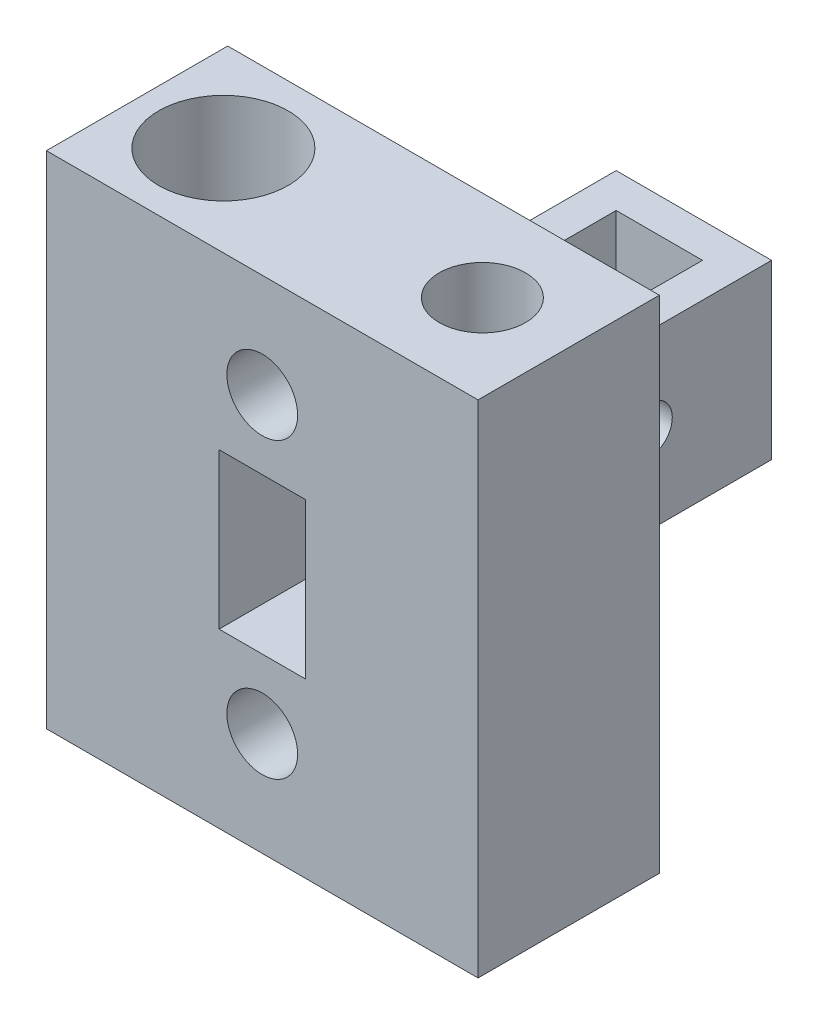
ISO-10303-21;
HEADER;
FILE_DESCRIPTION(('STEP AP214'),'2;1');
FILE_NAME('part.step','',(''),(''),'','','');
FILE_SCHEMA(('AUTOMOTIVE_DESIGN { 1 0 10303 214 1 1 1 1 }'));
ENDSEC;
DATA;
#1=APPLICATION_CONTEXT('core data for automotive mechanical design processes');
#2=APPLICATION_PROTOCOL_DEFINITION('international standard','automotive_design',2000,#1);
#3=PRODUCT_CONTEXT('',#1,'mechanical');
#4=PRODUCT('Part','Part','',(#3));
#5=PRODUCT_RELATED_PRODUCT_CATEGORY('part','',(#4));
#6=PRODUCT_DEFINITION_FORMATION('','',#4);
#7=PRODUCT_DEFINITION_CONTEXT('part definition',#1,'design');
#8=PRODUCT_DEFINITION('design','',#6,#7);
#9=PRODUCT_DEFINITION_SHAPE('','',#8);
#10=(LENGTH_UNIT() NAMED_UNIT(*) SI_UNIT(.MILLI.,.METRE.));
#11=(NAMED_UNIT(*) PLANE_ANGLE_UNIT() SI_UNIT($,.RADIAN.));
#12=(NAMED_UNIT(*) SI_UNIT($,.STERADIAN.) SOLID_ANGLE_UNIT());
#13=UNCERTAINTY_MEASURE_WITH_UNIT(LENGTH_MEASURE(1.E-05),#10,'distance_accuracy_value','');
#14=(GEOMETRIC_REPRESENTATION_CONTEXT(3) GLOBAL_UNCERTAINTY_ASSIGNED_CONTEXT((#13)) GLOBAL_UNIT_ASSIGNED_CONTEXT((#10,
#11,#12)) REPRESENTATION_CONTEXT('',''));
#15=CARTESIAN_POINT('',(0.,0.,0.));
#16=DIRECTION('',(0.,0.,1.));
#17=DIRECTION('',(1.,0.,0.));
#18=AXIS2_PLACEMENT_3D('',#15,#16,#17);
#19=CARTESIAN_POINT('',(-25.,58.,-10.5));
#20=DIRECTION('',(0.,0.,1.));
#21=DIRECTION('',(1.,0.,0.));
#22=AXIS2_PLACEMENT_3D('',#19,#20,#21);
#23=PLANE('',#22);
#24=DIRECTION('',(-1.,0.,0.));
#25=VECTOR('',#24,1.);
#26=CARTESIAN_POINT('',(-25.,0.,-10.5));
#27=LINE('',#26,#25);
#28=CARTESIAN_POINT('',(25.,0.,-10.5));
#29=VERTEX_POINT('',#28);
#30=CARTESIAN_POINT('',(-25.,0.,-10.5));
#31=VERTEX_POINT('',#30);
#32=EDGE_CURVE('E404',#29,#31,#27,.T.);
#33=ORIENTED_EDGE('',*,*,#32,.T.);
#34=DIRECTION('',(0.,-1.,0.));
#35=VECTOR('',#34,1.);
#36=CARTESIAN_POINT('',(-25.,58.,-10.5));
#37=LINE('',#36,#35);
#38=CARTESIAN_POINT('',(-25.,58.,-10.5));
#39=VERTEX_POINT('',#38);
#40=EDGE_CURVE('E413',#39,#31,#37,.T.);
#41=ORIENTED_EDGE('',*,*,#40,.F.);
#42=DIRECTION('',(-1.,0.,0.));
#43=VECTOR('',#42,1.);
#44=CARTESIAN_POINT('',(-25.,58.,-10.5));
#45=LINE('',#44,#43);
#46=CARTESIAN_POINT('',(25.,58.,-10.5));
#47=VERTEX_POINT('',#46);
#48=EDGE_CURVE('E394',#47,#39,#45,.T.);
#49=ORIENTED_EDGE('',*,*,#48,.F.);
#50=DIRECTION('',(0.,-1.,0.));
#51=VECTOR('',#50,1.);
#52=CARTESIAN_POINT('',(25.,58.,-10.5));
#53=LINE('',#52,#51);
#54=EDGE_CURVE('E41',#47,#29,#53,.T.);
#55=ORIENTED_EDGE('',*,*,#54,.T.);
#56=EDGE_LOOP('',(#33,#41,#49,#55));
#57=FACE_BOUND('',#56,.T.);
#58=DIRECTION('',(-1.,0.,0.));
#59=VECTOR('',#58,1.);
#60=CARTESIAN_POINT('',(0.,39.,-10.5));
#61=LINE('',#60,#59);
#62=CARTESIAN_POINT('',(9.,39.,-10.5));
#63=VERTEX_POINT('',#62);
#64=CARTESIAN_POINT('',(5.,39.,-10.5));
#65=VERTEX_POINT('',#64);
#66=EDGE_CURVE('E278',#63,#65,#61,.T.);
#67=ORIENTED_EDGE('',*,*,#66,.T.);
#68=DIRECTION('',(0.,-1.,0.));
#69=VECTOR('',#68,1.);
#70=CARTESIAN_POINT('',(4.99999999999999,0.,-10.5));
#71=LINE('',#70,#69);
#72=CARTESIAN_POINT('',(5.,38.,-10.5));
#73=VERTEX_POINT('',#72);
#74=EDGE_CURVE('E287',#65,#73,#71,.T.);
#75=ORIENTED_EDGE('',*,*,#74,.T.);
#76=DIRECTION('',(1.,0.,0.));
#77=VECTOR('',#76,1.);
#78=CARTESIAN_POINT('',(-5.,38.,-10.5));
#79=LINE('',#78,#77);
#80=CARTESIAN_POINT('',(-5.,38.,-10.5));
#81=VERTEX_POINT('',#80);
#82=EDGE_CURVE('E357',#81,#73,#79,.T.);
#83=ORIENTED_EDGE('',*,*,#82,.F.);
#84=DIRECTION('',(0.,-1.,0.));
#85=VECTOR('',#84,1.);
#86=CARTESIAN_POINT('',(-5.00000000000001,0.,-10.5));
#87=LINE('',#86,#85);
#88=CARTESIAN_POINT('',(-5.,39.,-10.5));
#89=VERTEX_POINT('',#88);
#90=EDGE_CURVE('E47',#89,#81,#87,.T.);
#91=ORIENTED_EDGE('',*,*,#90,.F.);
#92=DIRECTION('',(1.,0.,0.));
#93=VECTOR('',#92,1.);
#94=CARTESIAN_POINT('',(0.,39.,-10.5));
#95=LINE('',#94,#93);
#96=CARTESIAN_POINT('',(-9.00000000000001,39.,-10.5));
#97=VERTEX_POINT('',#96);
#98=EDGE_CURVE('E305',#97,#89,#95,.T.);
#99=ORIENTED_EDGE('',*,*,#98,.F.);
#100=DIRECTION('',(0.,-1.,0.));
#101=VECTOR('',#100,1.);
#102=CARTESIAN_POINT('',(-9.00000000000001,0.,-10.5));
#103=LINE('',#102,#101);
#104=CARTESIAN_POINT('',(-9.00000000000001,19.,-10.5));
#105=VERTEX_POINT('',#104);
#106=EDGE_CURVE('E310',#97,#105,#103,.T.);
#107=ORIENTED_EDGE('',*,*,#106,.T.);
#108=DIRECTION('',(1.,0.,0.));
#109=VECTOR('',#108,1.);
#110=CARTESIAN_POINT('',(0.,19.,-10.5));
#111=LINE('',#110,#109);
#112=CARTESIAN_POINT('',(-5.00000000000001,19.,-10.5));
#113=VERTEX_POINT('',#112);
#114=EDGE_CURVE('E314',#105,#113,#111,.T.);
#115=ORIENTED_EDGE('',*,*,#114,.T.);
#116=CARTESIAN_POINT('',(-5.,20.,-10.5));
#117=VERTEX_POINT('',#116);
#118=EDGE_CURVE('E11',#117,#113,#87,.T.);
#119=ORIENTED_EDGE('',*,*,#118,.F.);
#120=DIRECTION('',(-1.,0.,0.));
#121=VECTOR('',#120,1.);
#122=CARTESIAN_POINT('',(-5.,20.,-10.5));
#123=LINE('',#122,#121);
#124=CARTESIAN_POINT('',(5.,20.,-10.5));
#125=VERTEX_POINT('',#124);
#126=EDGE_CURVE('E332',#125,#117,#123,.T.);
#127=ORIENTED_EDGE('',*,*,#126,.F.);
#128=CARTESIAN_POINT('',(4.99999999999999,19.,-10.5));
#129=VERTEX_POINT('',#128);
#130=EDGE_CURVE('E295',#125,#129,#71,.T.);
#131=ORIENTED_EDGE('',*,*,#130,.T.);
#132=DIRECTION('',(-1.,0.,0.));
#133=VECTOR('',#132,1.);
#134=CARTESIAN_POINT('',(0.,19.,-10.5));
#135=LINE('',#134,#133);
#136=CARTESIAN_POINT('',(8.99999999999999,19.,-10.5));
#137=VERTEX_POINT('',#136);
#138=EDGE_CURVE('E292',#137,#129,#135,.T.);
#139=ORIENTED_EDGE('',*,*,#138,.F.);
#140=DIRECTION('',(0.,-1.,0.));
#141=VECTOR('',#140,1.);
#142=CARTESIAN_POINT('',(8.99999999999999,0.,-10.5));
#143=LINE('',#142,#141);
#144=EDGE_CURVE('E290',#63,#137,#143,.T.);
#145=ORIENTED_EDGE('',*,*,#144,.F.);
#146=EDGE_LOOP('',(#67,#75,#83,#91,#99,#107,#115,#119,#127,#131,#139,#145));
#147=FACE_BOUND('',#146,.T.);
#148=ADVANCED_FACE('F37',(#57,#147),#23,.F.);
#149=CARTESIAN_POINT('',(25.,58.,-10.5));
#150=DIRECTION('',(-1.,0.,0.));
#151=DIRECTION('',(0.,0.,1.));
#152=AXIS2_PLACEMENT_3D('',#149,#150,#151);
#153=PLANE('',#152);
#154=DIRECTION('',(0.,0.,-1.));
#155=VECTOR('',#154,1.);
#156=CARTESIAN_POINT('',(25.,0.,-10.5));
#157=LINE('',#156,#155);
#158=CARTESIAN_POINT('',(25.,0.,10.5));
#159=VERTEX_POINT('',#158);
#160=EDGE_CURVE('E388',#159,#29,#157,.T.);
#161=ORIENTED_EDGE('',*,*,#160,.T.);
#162=ORIENTED_EDGE('',*,*,#54,.F.);
#163=DIRECTION('',(0.,0.,-1.));
#164=VECTOR('',#163,1.);
#165=CARTESIAN_POINT('',(25.,58.,-10.5));
#166=LINE('',#165,#164);
#167=CARTESIAN_POINT('',(25.,58.,10.5));
#168=VERTEX_POINT('',#167);
#169=EDGE_CURVE('E391',#168,#47,#166,.T.);
#170=ORIENTED_EDGE('',*,*,#169,.F.);
#171=DIRECTION('',(0.,-1.,0.));
#172=VECTOR('',#171,1.);
#173=CARTESIAN_POINT('',(25.,58.,10.5));
#174=LINE('',#173,#172);
#175=EDGE_CURVE('E401',#168,#159,#174,.T.);
#176=ORIENTED_EDGE('',*,*,#175,.T.);
#177=EDGE_LOOP('',(#161,#162,#170,#176));
#178=FACE_BOUND('',#177,.T.);
#179=ADVANCED_FACE('F39',(#178),#153,.F.);
#180=CARTESIAN_POINT('',(-25.,58.,-10.5));
#181=DIRECTION('',(1.,0.,0.));
#182=DIRECTION('',(0.,0.,-1.));
#183=AXIS2_PLACEMENT_3D('',#180,#181,#182);
#184=PLANE('',#183);
#185=DIRECTION('',(0.,0.,1.));
#186=VECTOR('',#185,1.);
#187=CARTESIAN_POINT('',(-25.,0.,-10.5));
#188=LINE('',#187,#186);
#189=CARTESIAN_POINT('',(-25.,0.,10.5));
#190=VERTEX_POINT('',#189);
#191=EDGE_CURVE('E406',#31,#190,#188,.T.);
#192=ORIENTED_EDGE('',*,*,#191,.T.);
#193=DIRECTION('',(0.,-1.,0.));
#194=VECTOR('',#193,1.);
#195=CARTESIAN_POINT('',(-25.,58.,10.5));
#196=LINE('',#195,#194);
#197=CARTESIAN_POINT('',(-25.,58.,10.5));
#198=VERTEX_POINT('',#197);
#199=EDGE_CURVE('E411',#198,#190,#196,.T.);
#200=ORIENTED_EDGE('',*,*,#199,.F.);
#201=DIRECTION('',(0.,0.,1.));
#202=VECTOR('',#201,1.);
#203=CARTESIAN_POINT('',(-25.,58.,-10.5));
#204=LINE('',#203,#202);
#205=EDGE_CURVE('E397',#39,#198,#204,.T.);
#206=ORIENTED_EDGE('',*,*,#205,.F.);
#207=ORIENTED_EDGE('',*,*,#40,.T.);
#208=EDGE_LOOP('',(#192,#200,#206,#207));
#209=FACE_BOUND('',#208,.T.);
#210=ADVANCED_FACE('F431',(#209),#184,.F.);
#211=CARTESIAN_POINT('',(-25.,58.,10.5));
#212=DIRECTION('',(0.,0.,-1.));
#213=DIRECTION('',(-1.,0.,0.));
#214=AXIS2_PLACEMENT_3D('',#211,#212,#213);
#215=PLANE('',#214);
#216=CARTESIAN_POINT('',(0.,46.,10.5));
#217=DIRECTION('',(0.,0.,1.));
#218=DIRECTION('',(1.,0.,0.));
#219=AXIS2_PLACEMENT_3D('',#216,#217,#218);
#220=CIRCLE('',#219,4.1);
#221=CARTESIAN_POINT('',(4.1,46.,10.5));
#222=VERTEX_POINT('',#221);
#223=EDGE_CURVE('E333',#222,#222,#220,.T.);
#224=ORIENTED_EDGE('',*,*,#223,.F.);
#225=EDGE_LOOP('',(#224));
#226=FACE_BOUND('',#225,.T.);
#227=CARTESIAN_POINT('',(0.,12.,10.5));
#228=DIRECTION('',(0.,0.,1.));
#229=DIRECTION('',(-1.,0.,0.));
#230=AXIS2_PLACEMENT_3D('',#227,#228,#229);
#231=CIRCLE('',#230,4.1);
#232=CARTESIAN_POINT('',(-4.1,12.,10.5));
#233=VERTEX_POINT('',#232);
#234=EDGE_CURVE('E328',#233,#233,#231,.T.);
#235=ORIENTED_EDGE('',*,*,#234,.F.);
#236=EDGE_LOOP('',(#235));
#237=FACE_BOUND('',#236,.T.);
#238=DIRECTION('',(-1.,0.,0.));
#239=VECTOR('',#238,1.);
#240=CARTESIAN_POINT('',(-5.,38.,10.5));
#241=LINE('',#240,#239);
#242=CARTESIAN_POINT('',(5.,38.,10.5));
#243=VERTEX_POINT('',#242);
#244=CARTESIAN_POINT('',(-5.,38.,10.5));
#245=VERTEX_POINT('',#244);
#246=EDGE_CURVE('E345',#243,#245,#241,.T.);
#247=ORIENTED_EDGE('',*,*,#246,.F.);
#248=DIRECTION('',(0.,1.,0.));
#249=VECTOR('',#248,1.);
#250=CARTESIAN_POINT('',(5.,20.,10.5));
#251=LINE('',#250,#249);
#252=CARTESIAN_POINT('',(5.,20.,10.5));
#253=VERTEX_POINT('',#252);
#254=EDGE_CURVE('E343',#253,#243,#251,.T.);
#255=ORIENTED_EDGE('',*,*,#254,.F.);
#256=DIRECTION('',(1.,0.,0.));
#257=VECTOR('',#256,1.);
#258=CARTESIAN_POINT('',(-5.,20.,10.5));
#259=LINE('',#258,#257);
#260=CARTESIAN_POINT('',(-5.,20.,10.5));
#261=VERTEX_POINT('',#260);
#262=EDGE_CURVE('E351',#261,#253,#259,.T.);
#263=ORIENTED_EDGE('',*,*,#262,.F.);
#264=DIRECTION('',(0.,-1.,0.));
#265=VECTOR('',#264,1.);
#266=CARTESIAN_POINT('',(-5.,20.,10.5));
#267=LINE('',#266,#265);
#268=EDGE_CURVE('E348',#245,#261,#267,.T.);
#269=ORIENTED_EDGE('',*,*,#268,.F.);
#270=EDGE_LOOP('',(#247,#255,#263,#269));
#271=FACE_BOUND('',#270,.T.);
#272=DIRECTION('',(1.,0.,0.));
#273=VECTOR('',#272,1.);
#274=CARTESIAN_POINT('',(-25.,0.,10.5));
#275=LINE('',#274,#273);
#276=EDGE_CURVE('E395',#190,#159,#275,.T.);
#277=ORIENTED_EDGE('',*,*,#276,.T.);
#278=ORIENTED_EDGE('',*,*,#175,.F.);
#279=DIRECTION('',(1.,0.,0.));
#280=VECTOR('',#279,1.);
#281=CARTESIAN_POINT('',(-25.,58.,10.5));
#282=LINE('',#281,#280);
#283=EDGE_CURVE('E399',#198,#168,#282,.T.);
#284=ORIENTED_EDGE('',*,*,#283,.F.);
#285=ORIENTED_EDGE('',*,*,#199,.T.);
#286=EDGE_LOOP('',(#277,#278,#284,#285));
#287=FACE_BOUND('',#286,.T.);
#288=ADVANCED_FACE('F434',(#226,#237,#271,#287),#215,.F.);
#289=CARTESIAN_POINT('',(0.,58.,0.));
#290=DIRECTION('',(0.,1.,0.));
#291=DIRECTION('',(0.,0.,1.));
#292=AXIS2_PLACEMENT_3D('',#289,#290,#291);
#293=PLANE('',#292);
#294=CARTESIAN_POINT('',(15.,58.,0.));
#295=DIRECTION('',(0.,1.,0.));
#296=DIRECTION('',(0.,0.,1.));
#297=AXIS2_PLACEMENT_3D('',#294,#295,#296);
#298=CIRCLE('',#297,5.);
#299=CARTESIAN_POINT('',(15.,58.,5.));
#300=VERTEX_POINT('',#299);
#301=EDGE_CURVE('E376',#300,#300,#298,.T.);
#302=ORIENTED_EDGE('',*,*,#301,.F.);
#303=EDGE_LOOP('',(#302));
#304=FACE_BOUND('',#303,.T.);
#305=CARTESIAN_POINT('',(-15.,58.,0.));
#306=DIRECTION('',(0.,1.,0.));
#307=DIRECTION('',(0.,0.,1.));
#308=AXIS2_PLACEMENT_3D('',#305,#306,#307);
#309=CIRCLE('',#308,7.5);
#310=CARTESIAN_POINT('',(-15.,58.,7.5));
#311=VERTEX_POINT('',#310);
#312=EDGE_CURVE('E384',#311,#311,#309,.T.);
#313=ORIENTED_EDGE('',*,*,#312,.F.);
#314=EDGE_LOOP('',(#313));
#315=FACE_BOUND('',#314,.T.);
#316=ORIENTED_EDGE('',*,*,#169,.T.);
#317=ORIENTED_EDGE('',*,*,#48,.T.);
#318=ORIENTED_EDGE('',*,*,#205,.T.);
#319=ORIENTED_EDGE('',*,*,#283,.T.);
#320=EDGE_LOOP('',(#316,#317,#318,#319));
#321=FACE_BOUND('',#320,.T.);
#322=ADVANCED_FACE('F436',(#304,#315,#321),#293,.T.);
#323=CARTESIAN_POINT('',(0.,0.,0.));
#324=DIRECTION('',(0.,1.,0.));
#325=DIRECTION('',(0.,0.,1.));
#326=AXIS2_PLACEMENT_3D('',#323,#324,#325);
#327=PLANE('',#326);
#328=CARTESIAN_POINT('',(-15.,0.,0.));
#329=DIRECTION('',(0.,-1.,0.));
#330=DIRECTION('',(0.,0.,-1.));
#331=AXIS2_PLACEMENT_3D('',#328,#329,#330);
#332=CIRCLE('',#331,7.5);
#333=CARTESIAN_POINT('',(-15.,0.,-7.5));
#334=VERTEX_POINT('',#333);
#335=EDGE_CURVE('E372',#334,#334,#332,.T.);
#336=ORIENTED_EDGE('',*,*,#335,.F.);
#337=EDGE_LOOP('',(#336));
#338=FACE_BOUND('',#337,.T.);
#339=CARTESIAN_POINT('',(15.,0.,0.));
#340=DIRECTION('',(0.,1.,0.));
#341=DIRECTION('',(0.,0.,1.));
#342=AXIS2_PLACEMENT_3D('',#339,#340,#341);
#343=CIRCLE('',#342,5.);
#344=CARTESIAN_POINT('',(15.,0.,5.));
#345=VERTEX_POINT('',#344);
#346=EDGE_CURVE('E381',#345,#345,#343,.F.);
#347=ORIENTED_EDGE('',*,*,#346,.F.);
#348=EDGE_LOOP('',(#347));
#349=FACE_BOUND('',#348,.T.);
#350=ORIENTED_EDGE('',*,*,#160,.F.);
#351=ORIENTED_EDGE('',*,*,#276,.F.);
#352=ORIENTED_EDGE('',*,*,#191,.F.);
#353=ORIENTED_EDGE('',*,*,#32,.F.);
#354=EDGE_LOOP('',(#350,#351,#352,#353));
#355=FACE_BOUND('',#354,.T.);
#356=ADVANCED_FACE('F429',(#338,#349,#355),#327,.F.);
#357=CARTESIAN_POINT('',(-15.,34.,0.));
#358=DIRECTION('',(0.,1.,0.));
#359=DIRECTION('',(0.,0.,1.));
#360=AXIS2_PLACEMENT_3D('',#357,#358,#359);
#361=CYLINDRICAL_SURFACE('',#360,7.5);
#362=CARTESIAN_POINT('',(-15.,34.,0.));
#363=DIRECTION('',(0.,1.,0.));
#364=DIRECTION('',(0.,0.,1.));
#365=AXIS2_PLACEMENT_3D('',#362,#363,#364);
#366=CIRCLE('',#365,7.5);
#367=CARTESIAN_POINT('',(-15.,34.,7.5));
#368=VERTEX_POINT('',#367);
#369=EDGE_CURVE('E385',#368,#368,#366,.T.);
#370=ORIENTED_EDGE('',*,*,#369,.F.);
#371=EDGE_LOOP('',(#370));
#372=FACE_BOUND('',#371,.T.);
#373=ORIENTED_EDGE('',*,*,#312,.T.);
#374=EDGE_LOOP('',(#373));
#375=FACE_BOUND('',#374,.T.);
#376=ADVANCED_FACE('F444',(#372,#375),#361,.F.);
#377=CARTESIAN_POINT('',(-15.,34.,0.));
#378=DIRECTION('',(0.,1.,0.));
#379=DIRECTION('',(0.,0.,1.));
#380=AXIS2_PLACEMENT_3D('',#377,#378,#379);
#381=PLANE('',#380);
#382=CARTESIAN_POINT('',(-15.,34.,0.));
#383=DIRECTION('',(0.,1.,0.));
#384=DIRECTION('',(0.,0.,1.));
#385=AXIS2_PLACEMENT_3D('',#382,#383,#384);
#386=CIRCLE('',#385,4.5);
#387=CARTESIAN_POINT('',(-15.,34.,4.5));
#388=VERTEX_POINT('',#387);
#389=EDGE_CURVE('E369',#388,#388,#386,.F.);
#390=ORIENTED_EDGE('',*,*,#389,.T.);
#391=EDGE_LOOP('',(#390));
#392=FACE_BOUND('',#391,.T.);
#393=ORIENTED_EDGE('',*,*,#369,.T.);
#394=EDGE_LOOP('',(#393));
#395=FACE_BOUND('',#394,.T.);
#396=ADVANCED_FACE('F739',(#392,#395),#381,.T.);
#397=CARTESIAN_POINT('',(15.,-0.001000000000001,0.));
#398=DIRECTION('',(0.,1.,0.));
#399=DIRECTION('',(0.,0.,1.));
#400=AXIS2_PLACEMENT_3D('',#397,#398,#399);
#401=CYLINDRICAL_SURFACE('',#400,5.);
#402=ORIENTED_EDGE('',*,*,#301,.T.);
#403=EDGE_LOOP('',(#402));
#404=FACE_BOUND('',#403,.T.);
#405=ORIENTED_EDGE('',*,*,#346,.T.);
#406=EDGE_LOOP('',(#405));
#407=FACE_BOUND('',#406,.T.);
#408=ADVANCED_FACE('F735',(#404,#407),#401,.F.);
#409=CARTESIAN_POINT('',(-15.,24.,0.));
#410=DIRECTION('',(0.,-1.,0.));
#411=DIRECTION('',(0.,0.,-1.));
#412=AXIS2_PLACEMENT_3D('',#409,#410,#411);
#413=CYLINDRICAL_SURFACE('',#412,7.5);
#414=CARTESIAN_POINT('',(-15.,24.,0.));
#415=DIRECTION('',(0.,-1.,0.));
#416=DIRECTION('',(0.,0.,-1.));
#417=AXIS2_PLACEMENT_3D('',#414,#415,#416);
#418=CIRCLE('',#417,7.5);
#419=CARTESIAN_POINT('',(-15.,24.,-7.5));
#420=VERTEX_POINT('',#419);
#421=EDGE_CURVE('E373',#420,#420,#418,.T.);
#422=ORIENTED_EDGE('',*,*,#421,.F.);
#423=EDGE_LOOP('',(#422));
#424=FACE_BOUND('',#423,.T.);
#425=ORIENTED_EDGE('',*,*,#335,.T.);
#426=EDGE_LOOP('',(#425));
#427=FACE_BOUND('',#426,.T.);
#428=ADVANCED_FACE('F731',(#424,#427),#413,.F.);
#429=CARTESIAN_POINT('',(-15.,24.,0.));
#430=DIRECTION('',(0.,-1.,0.));
#431=DIRECTION('',(0.,0.,-1.));
#432=AXIS2_PLACEMENT_3D('',#429,#430,#431);
#433=PLANE('',#432);
#434=CARTESIAN_POINT('',(-15.,24.,0.));
#435=DIRECTION('',(0.,-1.,0.));
#436=DIRECTION('',(0.,0.,-1.));
#437=AXIS2_PLACEMENT_3D('',#434,#435,#436);
#438=CIRCLE('',#437,4.5);
#439=CARTESIAN_POINT('',(-15.,24.,-4.5));
#440=VERTEX_POINT('',#439);
#441=EDGE_CURVE('E366',#440,#440,#438,.F.);
#442=ORIENTED_EDGE('',*,*,#441,.T.);
#443=EDGE_LOOP('',(#442));
#444=FACE_BOUND('',#443,.T.);
#445=ORIENTED_EDGE('',*,*,#421,.T.);
#446=EDGE_LOOP('',(#445));
#447=FACE_BOUND('',#446,.T.);
#448=ADVANCED_FACE('F728',(#444,#447),#433,.T.);
#449=CARTESIAN_POINT('',(-15.,58.001,0.));
#450=DIRECTION('',(0.,-1.,0.));
#451=DIRECTION('',(0.,0.,-1.));
#452=AXIS2_PLACEMENT_3D('',#449,#450,#451);
#453=CYLINDRICAL_SURFACE('',#452,4.5);
#454=ORIENTED_EDGE('',*,*,#389,.F.);
#455=EDGE_LOOP('',(#454));
#456=FACE_BOUND('',#455,.T.);
#457=ORIENTED_EDGE('',*,*,#441,.F.);
#458=EDGE_LOOP('',(#457));
#459=FACE_BOUND('',#458,.T.);
#460=ADVANCED_FACE('F476',(#456,#459),#453,.F.);
#461=CARTESIAN_POINT('',(5.,20.,-10.501));
#462=DIRECTION('',(1.,0.,0.));
#463=DIRECTION('',(0.,0.,-1.));
#464=AXIS2_PLACEMENT_3D('',#461,#462,#463);
#465=PLANE('',#464);
#466=DIRECTION('',(0.,0.,1.));
#467=VECTOR('',#466,1.);
#468=CARTESIAN_POINT('',(5.,31.75,-10.501));
#469=LINE('',#468,#467);
#470=CARTESIAN_POINT('',(5.,31.75,-25.25));
#471=VERTEX_POINT('',#470);
#472=CARTESIAN_POINT('',(5.,31.75,-16.25));
#473=VERTEX_POINT('',#472);
#474=EDGE_CURVE('E253',#471,#473,#469,.T.);
#475=ORIENTED_EDGE('',*,*,#474,.T.);
#476=CARTESIAN_POINT('',(5.,29.,-16.25));
#477=DIRECTION('',(1.,0.,0.));
#478=DIRECTION('',(0.,0.,-1.));
#479=AXIS2_PLACEMENT_3D('',#476,#477,#478);
#480=CIRCLE('',#479,2.75);
#481=CARTESIAN_POINT('',(5.,26.25,-16.25));
#482=VERTEX_POINT('',#481);
#483=EDGE_CURVE('E261',#473,#482,#480,.T.);
#484=ORIENTED_EDGE('',*,*,#483,.T.);
#485=DIRECTION('',(0.,0.,-1.));
#486=VECTOR('',#485,1.);
#487=CARTESIAN_POINT('',(5.,26.25,-10.501));
#488=LINE('',#487,#486);
#489=CARTESIAN_POINT('',(5.,26.25,-25.25));
#490=VERTEX_POINT('',#489);
#491=EDGE_CURVE('E239',#482,#490,#488,.T.);
#492=ORIENTED_EDGE('',*,*,#491,.T.);
#493=CARTESIAN_POINT('',(5.,29.,-25.25));
#494=DIRECTION('',(1.,0.,0.));
#495=DIRECTION('',(0.,0.,-1.));
#496=AXIS2_PLACEMENT_3D('',#493,#494,#495);
#497=CIRCLE('',#496,2.75);
#498=EDGE_CURVE('E205',#490,#471,#497,.T.);
#499=ORIENTED_EDGE('',*,*,#498,.T.);
#500=EDGE_LOOP('',(#475,#484,#492,#499));
#501=FACE_BOUND('',#500,.T.);
#502=DIRECTION('',(0.,0.,1.));
#503=VECTOR('',#502,1.);
#504=CARTESIAN_POINT('',(5.,38.,-10.501));
#505=LINE('',#504,#503);
#506=EDGE_CURVE('E354',#73,#243,#505,.T.);
#507=ORIENTED_EDGE('',*,*,#506,.F.);
#508=ORIENTED_EDGE('',*,*,#74,.F.);
#509=DIRECTION('',(0.,0.,1.));
#510=VECTOR('',#509,1.);
#511=CARTESIAN_POINT('',(5.,39.,-35.5));
#512=LINE('',#511,#510);
#513=CARTESIAN_POINT('',(5.,39.,-35.5));
#514=VERTEX_POINT('',#513);
#515=EDGE_CURVE('E286',#514,#65,#512,.T.);
#516=ORIENTED_EDGE('',*,*,#515,.F.);
#517=DIRECTION('',(0.,-1.,0.));
#518=VECTOR('',#517,1.);
#519=CARTESIAN_POINT('',(4.99999999999999,0.,-35.5));
#520=LINE('',#519,#518);
#521=CARTESIAN_POINT('',(4.99999999999999,19.,-35.5));
#522=VERTEX_POINT('',#521);
#523=EDGE_CURVE('E283',#514,#522,#520,.T.);
#524=ORIENTED_EDGE('',*,*,#523,.T.);
#525=DIRECTION('',(0.,0.,1.));
#526=VECTOR('',#525,1.);
#527=CARTESIAN_POINT('',(4.99999999999999,19.,-35.5));
#528=LINE('',#527,#526);
#529=EDGE_CURVE('E298',#522,#129,#528,.T.);
#530=ORIENTED_EDGE('',*,*,#529,.T.);
#531=ORIENTED_EDGE('',*,*,#130,.F.);
#532=DIRECTION('',(0.,0.,1.));
#533=VECTOR('',#532,1.);
#534=CARTESIAN_POINT('',(5.,20.,-10.501));
#535=LINE('',#534,#533);
#536=EDGE_CURVE('E355',#125,#253,#535,.T.);
#537=ORIENTED_EDGE('',*,*,#536,.T.);
#538=ORIENTED_EDGE('',*,*,#254,.T.);
#539=EDGE_LOOP('',(#507,#508,#516,#524,#530,#531,#537,#538));
#540=FACE_BOUND('',#539,.T.);
#541=ADVANCED_FACE('F529',(#501,#540),#465,.F.);
#542=CARTESIAN_POINT('',(-5.,20.,-10.501));
#543=DIRECTION('',(0.,-1.,0.));
#544=DIRECTION('',(0.,0.,-1.));
#545=AXIS2_PLACEMENT_3D('',#542,#543,#544);
#546=PLANE('',#545);
#547=ORIENTED_EDGE('',*,*,#126,.T.);
#548=DIRECTION('',(0.,0.,1.));
#549=VECTOR('',#548,1.);
#550=CARTESIAN_POINT('',(-5.,20.,-10.501));
#551=LINE('',#550,#549);
#552=EDGE_CURVE('E358',#117,#261,#551,.T.);
#553=ORIENTED_EDGE('',*,*,#552,.T.);
#554=ORIENTED_EDGE('',*,*,#262,.T.);
#555=ORIENTED_EDGE('',*,*,#536,.F.);
#556=EDGE_LOOP('',(#547,#553,#554,#555));
#557=FACE_BOUND('',#556,.T.);
#558=ADVANCED_FACE('F533',(#557),#546,.F.);
#559=CARTESIAN_POINT('',(-5.,20.,-10.501));
#560=DIRECTION('',(-1.,0.,0.));
#561=DIRECTION('',(0.,0.,1.));
#562=AXIS2_PLACEMENT_3D('',#559,#560,#561);
#563=PLANE('',#562);
#564=DIRECTION('',(0.,0.,1.));
#565=VECTOR('',#564,1.);
#566=CARTESIAN_POINT('',(-5.,26.25,-10.501));
#567=LINE('',#566,#565);
#568=CARTESIAN_POINT('',(-5.,26.25,-25.25));
#569=VERTEX_POINT('',#568);
#570=CARTESIAN_POINT('',(-5.,26.25,-16.25));
#571=VERTEX_POINT('',#570);
#572=EDGE_CURVE('E236',#569,#571,#567,.T.);
#573=ORIENTED_EDGE('',*,*,#572,.T.);
#574=CARTESIAN_POINT('',(-5.,29.,-16.25));
#575=DIRECTION('',(-1.,0.,0.));
#576=DIRECTION('',(0.,0.,1.));
#577=AXIS2_PLACEMENT_3D('',#574,#575,#576);
#578=CIRCLE('',#577,2.75);
#579=CARTESIAN_POINT('',(-5.,31.75,-16.25));
#580=VERTEX_POINT('',#579);
#581=EDGE_CURVE('E258',#571,#580,#578,.T.);
#582=ORIENTED_EDGE('',*,*,#581,.T.);
#583=DIRECTION('',(0.,0.,-1.));
#584=VECTOR('',#583,1.);
#585=CARTESIAN_POINT('',(-5.,31.75,-10.501));
#586=LINE('',#585,#584);
#587=CARTESIAN_POINT('',(-5.,31.75,-25.25));
#588=VERTEX_POINT('',#587);
#589=EDGE_CURVE('E250',#580,#588,#586,.T.);
#590=ORIENTED_EDGE('',*,*,#589,.T.);
#591=CARTESIAN_POINT('',(-5.,29.,-25.25));
#592=DIRECTION('',(-1.,0.,0.));
#593=DIRECTION('',(0.,0.,1.));
#594=AXIS2_PLACEMENT_3D('',#591,#592,#593);
#595=CIRCLE('',#594,2.75);
#596=EDGE_CURVE('E244',#588,#569,#595,.T.);
#597=ORIENTED_EDGE('',*,*,#596,.T.);
#598=EDGE_LOOP('',(#573,#582,#590,#597));
#599=FACE_BOUND('',#598,.T.);
#600=ORIENTED_EDGE('',*,*,#552,.F.);
#601=ORIENTED_EDGE('',*,*,#118,.T.);
#602=DIRECTION('',(0.,0.,1.));
#603=VECTOR('',#602,1.);
#604=CARTESIAN_POINT('',(-5.00000000000001,19.,-35.5));
#605=LINE('',#604,#603);
#606=CARTESIAN_POINT('',(-5.,19.,-35.5));
#607=VERTEX_POINT('',#606);
#608=EDGE_CURVE('E322',#607,#113,#605,.T.);
#609=ORIENTED_EDGE('',*,*,#608,.F.);
#610=DIRECTION('',(0.,-1.,0.));
#611=VECTOR('',#610,1.);
#612=CARTESIAN_POINT('',(-5.00000000000001,0.,-35.5));
#613=LINE('',#612,#611);
#614=CARTESIAN_POINT('',(-5.,39.,-35.5));
#615=VERTEX_POINT('',#614);
#616=EDGE_CURVE('E306',#615,#607,#613,.T.);
#617=ORIENTED_EDGE('',*,*,#616,.F.);
#618=DIRECTION('',(0.,0.,1.));
#619=VECTOR('',#618,1.);
#620=CARTESIAN_POINT('',(-5.,39.,-35.5));
#621=LINE('',#620,#619);
#622=EDGE_CURVE('E325',#615,#89,#621,.T.);
#623=ORIENTED_EDGE('',*,*,#622,.T.);
#624=ORIENTED_EDGE('',*,*,#90,.T.);
#625=DIRECTION('',(0.,0.,1.));
#626=VECTOR('',#625,1.);
#627=CARTESIAN_POINT('',(-5.,38.,-10.501));
#628=LINE('',#627,#626);
#629=EDGE_CURVE('E360',#81,#245,#628,.T.);
#630=ORIENTED_EDGE('',*,*,#629,.T.);
#631=ORIENTED_EDGE('',*,*,#268,.T.);
#632=EDGE_LOOP('',(#600,#601,#609,#617,#623,#624,#630,#631));
#633=FACE_BOUND('',#632,.T.);
#634=ADVANCED_FACE('F540',(#599,#633),#563,.F.);
#635=CARTESIAN_POINT('',(-5.,38.,-10.501));
#636=DIRECTION('',(0.,1.,0.));
#637=DIRECTION('',(0.,0.,1.));
#638=AXIS2_PLACEMENT_3D('',#635,#636,#637);
#639=PLANE('',#638);
#640=ORIENTED_EDGE('',*,*,#82,.T.);
#641=ORIENTED_EDGE('',*,*,#506,.T.);
#642=ORIENTED_EDGE('',*,*,#246,.T.);
#643=ORIENTED_EDGE('',*,*,#629,.F.);
#644=EDGE_LOOP('',(#640,#641,#642,#643));
#645=FACE_BOUND('',#644,.T.);
#646=ADVANCED_FACE('F487',(#645),#639,.F.);
#647=CARTESIAN_POINT('',(0.,12.,-4.5));
#648=DIRECTION('',(0.,0.,1.));
#649=DIRECTION('',(1.,0.,0.));
#650=AXIS2_PLACEMENT_3D('',#647,#648,#649);
#651=CYLINDRICAL_SURFACE('',#650,4.1);
#652=CARTESIAN_POINT('',(0.,12.,-4.5));
#653=DIRECTION('',(0.,0.,1.));
#654=DIRECTION('',(-1.,0.,0.));
#655=AXIS2_PLACEMENT_3D('',#652,#653,#654);
#656=CIRCLE('',#655,4.1);
#657=CARTESIAN_POINT('',(-4.1,12.,-4.5));
#658=VERTEX_POINT('',#657);
#659=EDGE_CURVE('E336',#658,#658,#656,.T.);
#660=ORIENTED_EDGE('',*,*,#659,.F.);
#661=EDGE_LOOP('',(#660));
#662=FACE_BOUND('',#661,.T.);
#663=ORIENTED_EDGE('',*,*,#234,.T.);
#664=EDGE_LOOP('',(#663));
#665=FACE_BOUND('',#664,.T.);
#666=ADVANCED_FACE('F481',(#662,#665),#651,.F.);
#667=CARTESIAN_POINT('',(0.,12.,-4.5));
#668=DIRECTION('',(0.,0.,-1.));
#669=DIRECTION('',(-1.,0.,0.));
#670=AXIS2_PLACEMENT_3D('',#667,#668,#669);
#671=PLANE('',#670);
#672=ORIENTED_EDGE('',*,*,#659,.T.);
#673=EDGE_LOOP('',(#672));
#674=FACE_BOUND('',#673,.T.);
#675=ADVANCED_FACE('F486',(#674),#671,.F.);
#676=CARTESIAN_POINT('',(0.,46.,-4.5));
#677=DIRECTION('',(0.,0.,1.));
#678=DIRECTION('',(1.,0.,0.));
#679=AXIS2_PLACEMENT_3D('',#676,#677,#678);
#680=CYLINDRICAL_SURFACE('',#679,4.1);
#681=CARTESIAN_POINT('',(0.,46.,-4.5));
#682=DIRECTION('',(0.,0.,1.));
#683=DIRECTION('',(1.,0.,0.));
#684=AXIS2_PLACEMENT_3D('',#681,#682,#683);
#685=CIRCLE('',#684,4.1);
#686=CARTESIAN_POINT('',(4.1,46.,-4.5));
#687=VERTEX_POINT('',#686);
#688=EDGE_CURVE('E329',#687,#687,#685,.T.);
#689=ORIENTED_EDGE('',*,*,#688,.F.);
#690=EDGE_LOOP('',(#689));
#691=FACE_BOUND('',#690,.T.);
#692=ORIENTED_EDGE('',*,*,#223,.T.);
#693=EDGE_LOOP('',(#692));
#694=FACE_BOUND('',#693,.T.);
#695=ADVANCED_FACE('F499',(#691,#694),#680,.F.);
#696=CARTESIAN_POINT('',(0.,46.,-4.5));
#697=DIRECTION('',(0.,0.,1.));
#698=DIRECTION('',(1.,0.,0.));
#699=AXIS2_PLACEMENT_3D('',#696,#697,#698);
#700=PLANE('',#699);
#701=ORIENTED_EDGE('',*,*,#688,.T.);
#702=EDGE_LOOP('',(#701));
#703=FACE_BOUND('',#702,.T.);
#704=ADVANCED_FACE('F508',(#703),#700,.T.);
#705=CARTESIAN_POINT('',(0.,39.,-35.5));
#706=DIRECTION('',(0.,-1.,0.));
#707=DIRECTION('',(0.,0.,-1.));
#708=AXIS2_PLACEMENT_3D('',#705,#706,#707);
#709=PLANE('',#708);
#710=ORIENTED_EDGE('',*,*,#98,.T.);
#711=ORIENTED_EDGE('',*,*,#622,.F.);
#712=DIRECTION('',(1.,0.,0.));
#713=VECTOR('',#712,1.);
#714=CARTESIAN_POINT('',(-9.00000000000001,39.,-35.5));
#715=LINE('',#714,#713);
#716=EDGE_CURVE('E264',#615,#514,#715,.T.);
#717=ORIENTED_EDGE('',*,*,#716,.T.);
#718=ORIENTED_EDGE('',*,*,#515,.T.);
#719=ORIENTED_EDGE('',*,*,#66,.F.);
#720=DIRECTION('',(0.,0.,1.));
#721=VECTOR('',#720,1.);
#722=CARTESIAN_POINT('',(9.,39.,-35.5));
#723=LINE('',#722,#721);
#724=CARTESIAN_POINT('',(9.,39.,-39.5));
#725=VERTEX_POINT('',#724);
#726=EDGE_CURVE('E303',#725,#63,#723,.T.);
#727=ORIENTED_EDGE('',*,*,#726,.F.);
#728=DIRECTION('',(1.,0.,0.));
#729=VECTOR('',#728,1.);
#730=CARTESIAN_POINT('',(-9.00000000000001,39.,-39.5));
#731=LINE('',#730,#729);
#732=CARTESIAN_POINT('',(-9.00000000000001,39.,-39.5));
#733=VERTEX_POINT('',#732);
#734=EDGE_CURVE('E268',#733,#725,#731,.T.);
#735=ORIENTED_EDGE('',*,*,#734,.F.);
#736=DIRECTION('',(0.,0.,1.));
#737=VECTOR('',#736,1.);
#738=CARTESIAN_POINT('',(-9.00000000000001,39.,-35.5));
#739=LINE('',#738,#737);
#740=EDGE_CURVE('E309',#733,#97,#739,.T.);
#741=ORIENTED_EDGE('',*,*,#740,.T.);
#742=EDGE_LOOP('',(#710,#711,#717,#718,#719,#727,#735,#741));
#743=FACE_BOUND('',#742,.T.);
#744=ADVANCED_FACE('F517',(#743),#709,.F.);
#745=CARTESIAN_POINT('',(0.,19.,-35.5));
#746=DIRECTION('',(0.,-1.,0.));
#747=DIRECTION('',(1.,0.,0.));
#748=AXIS2_PLACEMENT_3D('',#745,#746,#747);
#749=PLANE('',#748);
#750=ORIENTED_EDGE('',*,*,#114,.F.);
#751=DIRECTION('',(0.,0.,1.));
#752=VECTOR('',#751,1.);
#753=CARTESIAN_POINT('',(-9.00000000000001,19.,-35.5));
#754=LINE('',#753,#752);
#755=CARTESIAN_POINT('',(-9.00000000000001,19.,-39.5));
#756=VERTEX_POINT('',#755);
#757=EDGE_CURVE('E319',#756,#105,#754,.T.);
#758=ORIENTED_EDGE('',*,*,#757,.F.);
#759=DIRECTION('',(-1.,0.,0.));
#760=VECTOR('',#759,1.);
#761=CARTESIAN_POINT('',(-9.00000000000001,19.,-39.5));
#762=LINE('',#761,#760);
#763=CARTESIAN_POINT('',(9.,19.,-39.5));
#764=VERTEX_POINT('',#763);
#765=EDGE_CURVE('E275',#764,#756,#762,.T.);
#766=ORIENTED_EDGE('',*,*,#765,.F.);
#767=DIRECTION('',(0.,0.,1.));
#768=VECTOR('',#767,1.);
#769=CARTESIAN_POINT('',(8.99999999999999,19.,-35.5));
#770=LINE('',#769,#768);
#771=EDGE_CURVE('E300',#764,#137,#770,.T.);
#772=ORIENTED_EDGE('',*,*,#771,.T.);
#773=ORIENTED_EDGE('',*,*,#138,.T.);
#774=ORIENTED_EDGE('',*,*,#529,.F.);
#775=DIRECTION('',(-1.,0.,0.));
#776=VECTOR('',#775,1.);
#777=CARTESIAN_POINT('',(-9.00000000000001,19.,-35.5));
#778=LINE('',#777,#776);
#779=EDGE_CURVE('E269',#522,#607,#778,.T.);
#780=ORIENTED_EDGE('',*,*,#779,.T.);
#781=ORIENTED_EDGE('',*,*,#608,.T.);
#782=EDGE_LOOP('',(#750,#758,#766,#772,#773,#774,#780,#781));
#783=FACE_BOUND('',#782,.T.);
#784=ADVANCED_FACE('F551',(#783),#749,.T.);
#785=CARTESIAN_POINT('',(-9.00000000000001,0.,-35.5));
#786=DIRECTION('',(-1.,0.,0.));
#787=DIRECTION('',(0.,0.,1.));
#788=AXIS2_PLACEMENT_3D('',#785,#786,#787);
#789=PLANE('',#788);
#790=CARTESIAN_POINT('',(-9.00000000000001,29.,-16.25));
#791=DIRECTION('',(-1.,0.,0.));
#792=DIRECTION('',(0.,0.,1.));
#793=AXIS2_PLACEMENT_3D('',#790,#791,#792);
#794=CIRCLE('',#793,2.75);
#795=CARTESIAN_POINT('',(-9.00000000000001,26.25,-16.25));
#796=VERTEX_POINT('',#795);
#797=CARTESIAN_POINT('',(-9.00000000000001,31.75,-16.25));
#798=VERTEX_POINT('',#797);
#799=EDGE_CURVE('E256',#796,#798,#794,.T.);
#800=ORIENTED_EDGE('',*,*,#799,.F.);
#801=DIRECTION('',(0.,0.,1.));
#802=VECTOR('',#801,1.);
#803=CARTESIAN_POINT('',(-9.00000000000001,26.25,-35.5));
#804=LINE('',#803,#802);
#805=CARTESIAN_POINT('',(-9.00000000000001,26.25,-25.25));
#806=VERTEX_POINT('',#805);
#807=EDGE_CURVE('E234',#806,#796,#804,.T.);
#808=ORIENTED_EDGE('',*,*,#807,.F.);
#809=CARTESIAN_POINT('',(-9.00000000000001,29.,-25.25));
#810=DIRECTION('',(-1.,0.,0.));
#811=DIRECTION('',(0.,0.,1.));
#812=AXIS2_PLACEMENT_3D('',#809,#810,#811);
#813=CIRCLE('',#812,2.75);
#814=CARTESIAN_POINT('',(-9.00000000000001,31.75,-25.25));
#815=VERTEX_POINT('',#814);
#816=EDGE_CURVE('E241',#815,#806,#813,.T.);
#817=ORIENTED_EDGE('',*,*,#816,.F.);
#818=DIRECTION('',(0.,0.,-1.));
#819=VECTOR('',#818,1.);
#820=CARTESIAN_POINT('',(-9.00000000000001,31.75,-35.5));
#821=LINE('',#820,#819);
#822=EDGE_CURVE('E248',#798,#815,#821,.T.);
#823=ORIENTED_EDGE('',*,*,#822,.F.);
#824=EDGE_LOOP('',(#800,#808,#817,#823));
#825=FACE_BOUND('',#824,.T.);
#826=ORIENTED_EDGE('',*,*,#106,.F.);
#827=ORIENTED_EDGE('',*,*,#740,.F.);
#828=DIRECTION('',(0.,1.,0.));
#829=VECTOR('',#828,1.);
#830=CARTESIAN_POINT('',(-9.00000000000001,19.,-39.5));
#831=LINE('',#830,#829);
#832=EDGE_CURVE('E265',#756,#733,#831,.T.);
#833=ORIENTED_EDGE('',*,*,#832,.F.);
#834=ORIENTED_EDGE('',*,*,#757,.T.);
#835=EDGE_LOOP('',(#826,#827,#833,#834));
#836=FACE_BOUND('',#835,.T.);
#837=ADVANCED_FACE('F560',(#825,#836),#789,.T.);
#838=CARTESIAN_POINT('',(8.99999999999999,0.,-35.5));
#839=DIRECTION('',(-1.,0.,0.));
#840=DIRECTION('',(0.,-1.,0.));
#841=AXIS2_PLACEMENT_3D('',#838,#839,#840);
#842=PLANE('',#841);
#843=DIRECTION('',(0.,0.,-1.));
#844=VECTOR('',#843,1.);
#845=CARTESIAN_POINT('',(8.99999999999999,26.25,-16.25));
#846=LINE('',#845,#844);
#847=CARTESIAN_POINT('',(9.,26.25,-16.25));
#848=VERTEX_POINT('',#847);
#849=CARTESIAN_POINT('',(8.99999999999999,26.25,-25.25));
#850=VERTEX_POINT('',#849);
#851=EDGE_CURVE('E211',#848,#850,#846,.T.);
#852=ORIENTED_EDGE('',*,*,#851,.F.);
#853=CARTESIAN_POINT('',(8.99999999999999,29.,-16.25));
#854=DIRECTION('',(1.,0.,0.));
#855=DIRECTION('',(0.,1.,0.));
#856=AXIS2_PLACEMENT_3D('',#853,#854,#855);
#857=CIRCLE('',#856,2.75);
#858=CARTESIAN_POINT('',(8.99999999999998,31.75,-16.25));
#859=VERTEX_POINT('',#858);
#860=EDGE_CURVE('E217',#859,#848,#857,.T.);
#861=ORIENTED_EDGE('',*,*,#860,.F.);
#862=DIRECTION('',(0.,0.,1.));
#863=VECTOR('',#862,1.);
#864=CARTESIAN_POINT('',(8.99999999999998,31.75,-16.25));
#865=LINE('',#864,#863);
#866=CARTESIAN_POINT('',(8.99999999999998,31.75,-25.25));
#867=VERTEX_POINT('',#866);
#868=EDGE_CURVE('E222',#867,#859,#865,.T.);
#869=ORIENTED_EDGE('',*,*,#868,.F.);
#870=CARTESIAN_POINT('',(8.99999999999999,29.,-25.25));
#871=DIRECTION('',(1.,0.,0.));
#872=DIRECTION('',(0.,1.,0.));
#873=AXIS2_PLACEMENT_3D('',#870,#871,#872);
#874=CIRCLE('',#873,2.75);
#875=EDGE_CURVE('E202',#850,#867,#874,.T.);
#876=ORIENTED_EDGE('',*,*,#875,.F.);
#877=EDGE_LOOP('',(#852,#861,#869,#876));
#878=FACE_BOUND('',#877,.T.);
#879=ORIENTED_EDGE('',*,*,#144,.T.);
#880=ORIENTED_EDGE('',*,*,#771,.F.);
#881=DIRECTION('',(0.,-1.,0.));
#882=VECTOR('',#881,1.);
#883=CARTESIAN_POINT('',(9.,19.,-39.5));
#884=LINE('',#883,#882);
#885=EDGE_CURVE('E272',#725,#764,#884,.T.);
#886=ORIENTED_EDGE('',*,*,#885,.F.);
#887=ORIENTED_EDGE('',*,*,#726,.T.);
#888=EDGE_LOOP('',(#879,#880,#886,#887));
#889=FACE_BOUND('',#888,.T.);
#890=ADVANCED_FACE('F219',(#878,#889),#842,.F.);
#891=CARTESIAN_POINT('',(0.,0.,-35.5));
#892=DIRECTION('',(0.,0.,-1.));
#893=DIRECTION('',(-1.,0.,0.));
#894=AXIS2_PLACEMENT_3D('',#891,#892,#893);
#895=PLANE('',#894);
#896=ORIENTED_EDGE('',*,*,#716,.F.);
#897=ORIENTED_EDGE('',*,*,#616,.T.);
#898=ORIENTED_EDGE('',*,*,#779,.F.);
#899=ORIENTED_EDGE('',*,*,#523,.F.);
#900=EDGE_LOOP('',(#896,#897,#898,#899));
#901=FACE_BOUND('',#900,.T.);
#902=ADVANCED_FACE('F575',(#901),#895,.F.);
#903=CARTESIAN_POINT('',(0.,0.,-39.5));
#904=DIRECTION('',(0.,0.,-1.));
#905=DIRECTION('',(-1.,0.,0.));
#906=AXIS2_PLACEMENT_3D('',#903,#904,#905);
#907=PLANE('',#906);
#908=ORIENTED_EDGE('',*,*,#832,.T.);
#909=ORIENTED_EDGE('',*,*,#734,.T.);
#910=ORIENTED_EDGE('',*,*,#885,.T.);
#911=ORIENTED_EDGE('',*,*,#765,.T.);
#912=EDGE_LOOP('',(#908,#909,#910,#911));
#913=FACE_BOUND('',#912,.T.);
#914=ADVANCED_FACE('F582',(#913),#907,.T.);
#915=CARTESIAN_POINT('',(-25.,26.25,-16.25));
#916=DIRECTION('',(0.,-1.,0.));
#917=DIRECTION('',(0.,0.,-1.));
#918=AXIS2_PLACEMENT_3D('',#915,#916,#917);
#919=PLANE('',#918);
#920=DIRECTION('',(1.,0.,0.));
#921=VECTOR('',#920,1.);
#922=CARTESIAN_POINT('',(-25.,26.25,-16.25));
#923=LINE('',#922,#921);
#924=EDGE_CURVE('E214',#482,#848,#923,.T.);
#925=ORIENTED_EDGE('',*,*,#924,.T.);
#926=ORIENTED_EDGE('',*,*,#851,.T.);
#927=DIRECTION('',(1.,0.,0.));
#928=VECTOR('',#927,1.);
#929=CARTESIAN_POINT('',(-25.,26.25,-25.25));
#930=LINE('',#929,#928);
#931=EDGE_CURVE('E54',#490,#850,#930,.T.);
#932=ORIENTED_EDGE('',*,*,#931,.F.);
#933=ORIENTED_EDGE('',*,*,#491,.F.);
#934=EDGE_LOOP('',(#925,#926,#932,#933));
#935=FACE_BOUND('',#934,.T.);
#936=ADVANCED_FACE('F212',(#935),#919,.F.);
#937=CARTESIAN_POINT('',(-25.,29.,-25.25));
#938=DIRECTION('',(1.,0.,0.));
#939=DIRECTION('',(0.,1.,0.));
#940=AXIS2_PLACEMENT_3D('',#937,#938,#939);
#941=CYLINDRICAL_SURFACE('',#940,2.75);
#942=ORIENTED_EDGE('',*,*,#931,.T.);
#943=ORIENTED_EDGE('',*,*,#875,.T.);
#944=DIRECTION('',(1.,0.,0.));
#945=VECTOR('',#944,1.);
#946=CARTESIAN_POINT('',(-25.,31.75,-25.25));
#947=LINE('',#946,#945);
#948=EDGE_CURVE('E231',#471,#867,#947,.T.);
#949=ORIENTED_EDGE('',*,*,#948,.F.);
#950=ORIENTED_EDGE('',*,*,#498,.F.);
#951=EDGE_LOOP('',(#942,#943,#949,#950));
#952=FACE_BOUND('',#951,.T.);
#953=ADVANCED_FACE('F199',(#952),#941,.F.);
#954=CARTESIAN_POINT('',(-25.,31.75,-16.25));
#955=DIRECTION('',(0.,1.,0.));
#956=DIRECTION('',(0.,0.,1.));
#957=AXIS2_PLACEMENT_3D('',#954,#955,#956);
#958=PLANE('',#957);
#959=ORIENTED_EDGE('',*,*,#948,.T.);
#960=ORIENTED_EDGE('',*,*,#868,.T.);
#961=DIRECTION('',(1.,0.,0.));
#962=VECTOR('',#961,1.);
#963=CARTESIAN_POINT('',(-25.,31.75,-16.25));
#964=LINE('',#963,#962);
#965=EDGE_CURVE('E227',#473,#859,#964,.T.);
#966=ORIENTED_EDGE('',*,*,#965,.F.);
#967=ORIENTED_EDGE('',*,*,#474,.F.);
#968=EDGE_LOOP('',(#959,#960,#966,#967));
#969=FACE_BOUND('',#968,.T.);
#970=ADVANCED_FACE('F602',(#969),#958,.F.);
#971=CARTESIAN_POINT('',(-25.,29.,-16.25));
#972=DIRECTION('',(1.,0.,0.));
#973=DIRECTION('',(0.,1.,0.));
#974=AXIS2_PLACEMENT_3D('',#971,#972,#973);
#975=CYLINDRICAL_SURFACE('',#974,2.75);
#976=ORIENTED_EDGE('',*,*,#965,.T.);
#977=ORIENTED_EDGE('',*,*,#860,.T.);
#978=ORIENTED_EDGE('',*,*,#924,.F.);
#979=ORIENTED_EDGE('',*,*,#483,.F.);
#980=EDGE_LOOP('',(#976,#977,#978,#979));
#981=FACE_BOUND('',#980,.T.);
#982=ADVANCED_FACE('F610',(#981),#975,.F.);
#983=EDGE_CURVE('E62',#796,#571,#923,.T.);
#984=ORIENTED_EDGE('',*,*,#983,.F.);
#985=ORIENTED_EDGE('',*,*,#799,.T.);
#986=EDGE_CURVE('E229',#798,#580,#964,.T.);
#987=ORIENTED_EDGE('',*,*,#986,.T.);
#988=ORIENTED_EDGE('',*,*,#581,.F.);
#989=EDGE_LOOP('',(#984,#985,#987,#988));
#990=FACE_BOUND('',#989,.T.);
#991=ADVANCED_FACE('F619',(#990),#975,.F.);
#992=ORIENTED_EDGE('',*,*,#986,.F.);
#993=ORIENTED_EDGE('',*,*,#822,.T.);
#994=EDGE_CURVE('E230',#815,#588,#947,.T.);
#995=ORIENTED_EDGE('',*,*,#994,.T.);
#996=ORIENTED_EDGE('',*,*,#589,.F.);
#997=EDGE_LOOP('',(#992,#993,#995,#996));
#998=FACE_BOUND('',#997,.T.);
#999=ADVANCED_FACE('F613',(#998),#958,.F.);
#1000=ORIENTED_EDGE('',*,*,#994,.F.);
#1001=ORIENTED_EDGE('',*,*,#816,.T.);
#1002=EDGE_CURVE('E207',#806,#569,#930,.T.);
#1003=ORIENTED_EDGE('',*,*,#1002,.T.);
#1004=ORIENTED_EDGE('',*,*,#596,.F.);
#1005=EDGE_LOOP('',(#1000,#1001,#1003,#1004));
#1006=FACE_BOUND('',#1005,.T.);
#1007=ADVANCED_FACE('F604',(#1006),#941,.F.);
#1008=ORIENTED_EDGE('',*,*,#1002,.F.);
#1009=ORIENTED_EDGE('',*,*,#807,.T.);
#1010=ORIENTED_EDGE('',*,*,#983,.T.);
#1011=ORIENTED_EDGE('',*,*,#572,.F.);
#1012=EDGE_LOOP('',(#1008,#1009,#1010,#1011));
#1013=FACE_BOUND('',#1012,.T.);
#1014=ADVANCED_FACE('F596',(#1013),#919,.F.);
#1015=CLOSED_SHELL('',(#148,#179,#210,#288,#322,#356,#376,#396,#408,#428,#448,#460,#541,#558,
#634,#646,#666,#675,#695,#704,#744,#784,#837,#890,#902,#914,#936,#953,#970,#982,#991,#999,#1007,#1014));
#1016=MANIFOLD_SOLID_BREP('B2',#1015);
#1017=ADVANCED_BREP_SHAPE_REPRESENTATION('',(#18,#1016),#14);
#1018=SHAPE_DEFINITION_REPRESENTATION(#9,#1017);
ENDSEC;
END-ISO-10303-21;
